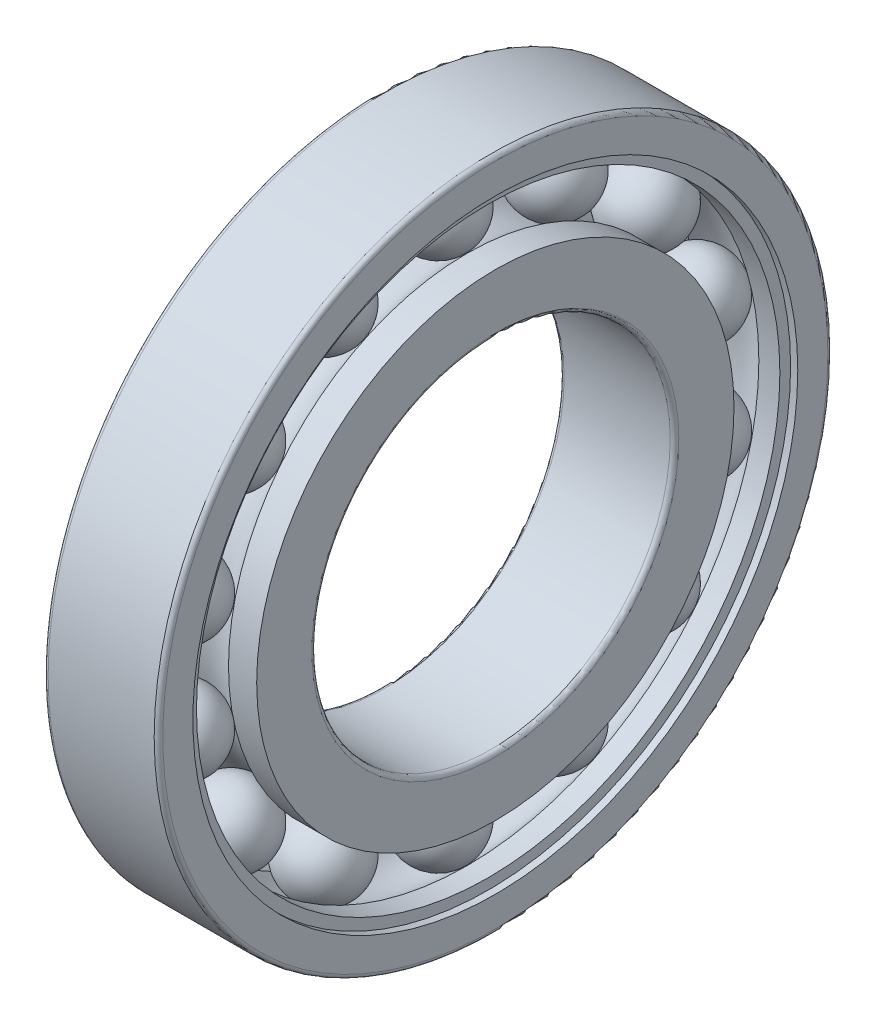
ISO-10303-21;
HEADER;
FILE_DESCRIPTION(('STEP AP214'),'2;1');
FILE_NAME('part.step','',(''),(''),'','','');
FILE_SCHEMA(('AUTOMOTIVE_DESIGN { 1 0 10303 214 1 1 1 1 }'));
ENDSEC;
DATA;
#1=APPLICATION_CONTEXT('core data for automotive mechanical design processes');
#2=APPLICATION_PROTOCOL_DEFINITION('international standard','automotive_design',2000,#1);
#3=PRODUCT_CONTEXT('',#1,'mechanical');
#4=PRODUCT('Part','Part','',(#3));
#5=PRODUCT_RELATED_PRODUCT_CATEGORY('part','',(#4));
#6=PRODUCT_DEFINITION_FORMATION('','',#4);
#7=PRODUCT_DEFINITION_CONTEXT('part definition',#1,'design');
#8=PRODUCT_DEFINITION('design','',#6,#7);
#9=PRODUCT_DEFINITION_SHAPE('','',#8);
#10=(LENGTH_UNIT() NAMED_UNIT(*) SI_UNIT(.MILLI.,.METRE.));
#11=(NAMED_UNIT(*) PLANE_ANGLE_UNIT() SI_UNIT($,.RADIAN.));
#12=(NAMED_UNIT(*) SI_UNIT($,.STERADIAN.) SOLID_ANGLE_UNIT());
#13=UNCERTAINTY_MEASURE_WITH_UNIT(LENGTH_MEASURE(1.E-05),#10,'distance_accuracy_value','');
#14=(GEOMETRIC_REPRESENTATION_CONTEXT(3) GLOBAL_UNCERTAINTY_ASSIGNED_CONTEXT((#13)) GLOBAL_UNIT_ASSIGNED_CONTEXT((#10,
#11,#12)) REPRESENTATION_CONTEXT('',''));
#15=CARTESIAN_POINT('',(0.,0.,0.));
#16=DIRECTION('',(0.,0.,1.));
#17=DIRECTION('',(1.,0.,0.));
#18=AXIS2_PLACEMENT_3D('',#15,#16,#17);
#19=CARTESIAN_POINT('',(0.,16.6679240561949,8.02684917367461));
#20=DIRECTION('',(-1.,0.,0.));
#21=DIRECTION('',(0.,0.900968867902425,0.433883739117546));
#22=AXIS2_PLACEMENT_3D('',#19,#20,#21);
#23=SPHERICAL_SURFACE('',#22,2.725);
#24=CARTESIAN_POINT('',(-2.725,16.6679240561949,8.02684917367461));
#25=VERTEX_POINT('',#24);
#26=VERTEX_LOOP('',#25);
#27=FACE_BOUND('',#26,.T.);
#28=ADVANCED_FACE('F37',(#27),#23,.T.);
#29=CLOSED_SHELL('',(#28));
#30=MANIFOLD_SOLID_BREP('B2',#29);
#31=CARTESIAN_POINT('',(0.,11.5345613343867,14.4638824256584));
#32=DIRECTION('',(-1.,0.,0.));
#33=DIRECTION('',(0.,0.623489801858743,0.781831482468022));
#34=AXIS2_PLACEMENT_3D('',#31,#32,#33);
#35=SPHERICAL_SURFACE('',#34,2.725);
#36=CARTESIAN_POINT('',(-2.725,11.5345613343867,14.4638824256584));
#37=VERTEX_POINT('',#36);
#38=VERTEX_LOOP('',#37);
#39=FACE_BOUND('',#38,.T.);
#40=ADVANCED_FACE('F55',(#39),#35,.T.);
#41=CLOSED_SHELL('',(#40));
#42=MANIFOLD_SOLID_BREP('B6',#41);
#43=CARTESIAN_POINT('',(0.,4.11663727819201,18.0361663753637));
#44=DIRECTION('',(-1.,0.,0.));
#45=DIRECTION('',(0.,0.222520933956325,0.974927912181821));
#46=AXIS2_PLACEMENT_3D('',#43,#44,#45);
#47=SPHERICAL_SURFACE('',#46,2.725);
#48=CARTESIAN_POINT('',(-2.725,4.11663727819201,18.0361663753637));
#49=VERTEX_POINT('',#48);
#50=VERTEX_LOOP('',#49);
#51=FACE_BOUND('',#50,.T.);
#52=ADVANCED_FACE('F73',(#51),#47,.T.);
#53=CLOSED_SHELL('',(#52));
#54=MANIFOLD_SOLID_BREP('B33',#53);
#55=CARTESIAN_POINT('',(0.,-4.11663727819164,18.0361663753638));
#56=DIRECTION('',(-1.,0.,0.));
#57=DIRECTION('',(0.,-0.222520933956305,0.974927912181826));
#58=AXIS2_PLACEMENT_3D('',#55,#56,#57);
#59=SPHERICAL_SURFACE('',#58,2.725);
#60=CARTESIAN_POINT('',(-2.725,-4.11663727819164,18.0361663753638));
#61=VERTEX_POINT('',#60);
#62=VERTEX_LOOP('',#61);
#63=FACE_BOUND('',#62,.T.);
#64=ADVANCED_FACE('F91',(#63),#59,.T.);
#65=CLOSED_SHELL('',(#64));
#66=MANIFOLD_SOLID_BREP('B51',#65);
#67=CARTESIAN_POINT('',(0.,-11.5345613343864,14.4638824256587));
#68=DIRECTION('',(-1.,0.,0.));
#69=DIRECTION('',(0.,-0.623489801858727,0.781831482468035));
#70=AXIS2_PLACEMENT_3D('',#67,#68,#69);
#71=SPHERICAL_SURFACE('',#70,2.725);
#72=CARTESIAN_POINT('',(-2.725,-11.5345613343864,14.4638824256587));
#73=VERTEX_POINT('',#72);
#74=VERTEX_LOOP('',#73);
#75=FACE_BOUND('',#74,.T.);
#76=ADVANCED_FACE('F109',(#75),#71,.T.);
#77=CLOSED_SHELL('',(#76));
#78=MANIFOLD_SOLID_BREP('B69',#77);
#79=CARTESIAN_POINT('',(0.,-16.6679240561947,8.02684917367496));
#80=DIRECTION('',(-1.,0.,0.));
#81=DIRECTION('',(0.,-0.900968867902416,0.433883739117565));
#82=AXIS2_PLACEMENT_3D('',#79,#80,#81);
#83=SPHERICAL_SURFACE('',#82,2.725);
#84=CARTESIAN_POINT('',(-2.725,-16.6679240561947,8.02684917367496));
#85=VERTEX_POINT('',#84);
#86=VERTEX_LOOP('',#85);
#87=FACE_BOUND('',#86,.T.);
#88=ADVANCED_FACE('F127',(#87),#83,.T.);
#89=CLOSED_SHELL('',(#88));
#90=MANIFOLD_SOLID_BREP('B87',#89);
#91=CARTESIAN_POINT('',(0.,-18.5,0.));
#92=DIRECTION('',(-1.,0.,0.));
#93=DIRECTION('',(0.,-1.,0.));
#94=AXIS2_PLACEMENT_3D('',#91,#92,#93);
#95=SPHERICAL_SURFACE('',#94,2.725);
#96=CARTESIAN_POINT('',(-2.725,-18.5,0.));
#97=VERTEX_POINT('',#96);
#98=VERTEX_LOOP('',#97);
#99=FACE_BOUND('',#98,.T.);
#100=ADVANCED_FACE('F145',(#99),#95,.T.);
#101=CLOSED_SHELL('',(#100));
#102=MANIFOLD_SOLID_BREP('B105',#101);
#103=CARTESIAN_POINT('',(0.,-16.6679240561948,-8.02684917367472));
#104=DIRECTION('',(-1.,0.,0.));
#105=DIRECTION('',(0.,-0.900968867902422,-0.433883739117553));
#106=AXIS2_PLACEMENT_3D('',#103,#104,#105);
#107=SPHERICAL_SURFACE('',#106,2.725);
#108=CARTESIAN_POINT('',(-2.725,-16.6679240561948,-8.02684917367472));
#109=VERTEX_POINT('',#108);
#110=VERTEX_LOOP('',#109);
#111=FACE_BOUND('',#110,.T.);
#112=ADVANCED_FACE('F163',(#111),#107,.T.);
#113=CLOSED_SHELL('',(#112));
#114=MANIFOLD_SOLID_BREP('B123',#113);
#115=CARTESIAN_POINT('',(0.,-11.5345613343866,-14.4638824256585));
#116=DIRECTION('',(-1.,0.,0.));
#117=DIRECTION('',(0.,-0.623489801858737,-0.781831482468027));
#118=AXIS2_PLACEMENT_3D('',#115,#116,#117);
#119=SPHERICAL_SURFACE('',#118,2.725);
#120=CARTESIAN_POINT('',(-2.725,-11.5345613343866,-14.4638824256585));
#121=VERTEX_POINT('',#120);
#122=VERTEX_LOOP('',#121);
#123=FACE_BOUND('',#122,.T.);
#124=ADVANCED_FACE('F181',(#123),#119,.T.);
#125=CLOSED_SHELL('',(#124));
#126=MANIFOLD_SOLID_BREP('B141',#125);
#127=CARTESIAN_POINT('',(0.,-4.11663727819189,-18.0361663753637));
#128=DIRECTION('',(-1.,0.,0.));
#129=DIRECTION('',(0.,-0.222520933956318,-0.974927912181823));
#130=AXIS2_PLACEMENT_3D('',#127,#128,#129);
#131=SPHERICAL_SURFACE('',#130,2.725);
#132=CARTESIAN_POINT('',(-2.725,-4.11663727819189,-18.0361663753637));
#133=VERTEX_POINT('',#132);
#134=VERTEX_LOOP('',#133);
#135=FACE_BOUND('',#134,.T.);
#136=ADVANCED_FACE('F199',(#135),#131,.T.);
#137=CLOSED_SHELL('',(#136));
#138=MANIFOLD_SOLID_BREP('B159',#137);
#139=CARTESIAN_POINT('',(0.,4.11663727819176,-18.0361663753637));
#140=DIRECTION('',(-1.,0.,0.));
#141=DIRECTION('',(0.,0.222520933956311,-0.974927912181824));
#142=AXIS2_PLACEMENT_3D('',#139,#140,#141);
#143=SPHERICAL_SURFACE('',#142,2.725);
#144=CARTESIAN_POINT('',(-2.725,4.11663727819176,-18.0361663753637));
#145=VERTEX_POINT('',#144);
#146=VERTEX_LOOP('',#145);
#147=FACE_BOUND('',#146,.T.);
#148=ADVANCED_FACE('F217',(#147),#143,.T.);
#149=CLOSED_SHELL('',(#148));
#150=MANIFOLD_SOLID_BREP('B177',#149);
#151=CARTESIAN_POINT('',(0.,11.5345613343865,-14.4638824256586));
#152=DIRECTION('',(-1.,0.,0.));
#153=DIRECTION('',(0.,0.623489801858732,-0.781831482468031));
#154=AXIS2_PLACEMENT_3D('',#151,#152,#153);
#155=SPHERICAL_SURFACE('',#154,2.725);
#156=CARTESIAN_POINT('',(-2.725,11.5345613343865,-14.4638824256586));
#157=VERTEX_POINT('',#156);
#158=VERTEX_LOOP('',#157);
#159=FACE_BOUND('',#158,.T.);
#160=ADVANCED_FACE('F235',(#159),#155,.T.);
#161=CLOSED_SHELL('',(#160));
#162=MANIFOLD_SOLID_BREP('B195',#161);
#163=CARTESIAN_POINT('',(0.,16.6679240561947,-8.02684917367484));
#164=DIRECTION('',(-1.,0.,0.));
#165=DIRECTION('',(0.,0.900968867902419,-0.433883739117559));
#166=AXIS2_PLACEMENT_3D('',#163,#164,#165);
#167=SPHERICAL_SURFACE('',#166,2.725);
#168=CARTESIAN_POINT('',(-2.725,16.6679240561947,-8.02684917367484));
#169=VERTEX_POINT('',#168);
#170=VERTEX_LOOP('',#169);
#171=FACE_BOUND('',#170,.T.);
#172=ADVANCED_FACE('F253',(#171),#167,.T.);
#173=CLOSED_SHELL('',(#172));
#174=MANIFOLD_SOLID_BREP('B213',#173);
#175=CARTESIAN_POINT('',(0.,18.5,0.));
#176=DIRECTION('',(-1.,0.,0.));
#177=DIRECTION('',(0.,1.,0.));
#178=AXIS2_PLACEMENT_3D('',#175,#176,#177);
#179=SPHERICAL_SURFACE('',#178,2.725);
#180=CARTESIAN_POINT('',(-2.725,18.5,0.));
#181=VERTEX_POINT('',#180);
#182=VERTEX_LOOP('',#181);
#183=FACE_BOUND('',#182,.T.);
#184=ADVANCED_FACE('F273',(#183),#179,.T.);
#185=CLOSED_SHELL('',(#184));
#186=MANIFOLD_SOLID_BREP('B231',#185);
#187=CARTESIAN_POINT('',(-4.00000000000001,0.,0.));
#188=DIRECTION('',(1.,0.,0.));
#189=DIRECTION('',(0.,0.,-1.));
#190=AXIS2_PLACEMENT_3D('',#187,#188,#189);
#191=PLANE('',#190);
#192=CARTESIAN_POINT('',(-4.00000000000001,0.,0.));
#193=DIRECTION('',(1.,0.,0.));
#194=DIRECTION('',(0.,0.,-1.));
#195=AXIS2_PLACEMENT_3D('',#192,#193,#194);
#196=CIRCLE('',#195,23.2);
#197=CARTESIAN_POINT('',(-4.00000000000001,0.,-23.2));
#198=VERTEX_POINT('',#197);
#199=EDGE_CURVE('E307',#198,#198,#196,.F.);
#200=ORIENTED_EDGE('',*,*,#199,.T.);
#201=EDGE_LOOP('',(#200));
#202=FACE_BOUND('',#201,.T.);
#203=CARTESIAN_POINT('',(-3.99999999999999,0.,0.));
#204=DIRECTION('',(1.,0.,0.));
#205=DIRECTION('',(0.,0.,-1.));
#206=AXIS2_PLACEMENT_3D('',#203,#204,#205);
#207=CIRCLE('',#206,21.1);
#208=CARTESIAN_POINT('',(-3.99999999999999,0.,-21.1));
#209=VERTEX_POINT('',#208);
#210=EDGE_CURVE('E328',#209,#209,#207,.T.);
#211=ORIENTED_EDGE('',*,*,#210,.T.);
#212=EDGE_LOOP('',(#211));
#213=FACE_BOUND('',#212,.T.);
#214=ADVANCED_FACE('F292',(#202,#213),#191,.F.);
#215=CARTESIAN_POINT('',(0.,0.,0.));
#216=DIRECTION('',(-1.,0.,0.));
#217=DIRECTION('',(0.,0.,1.));
#218=AXIS2_PLACEMENT_3D('',#215,#216,#217);
#219=CYLINDRICAL_SURFACE('',#218,20.35);
#220=CARTESIAN_POINT('',(-2.03469899493758,0.,0.));
#221=DIRECTION('',(-1.,0.,0.));
#222=DIRECTION('',(0.,0.,1.));
#223=AXIS2_PLACEMENT_3D('',#220,#221,#222);
#224=CIRCLE('',#223,20.35);
#225=CARTESIAN_POINT('',(-2.03469899493758,0.,20.35));
#226=VERTEX_POINT('',#225);
#227=EDGE_CURVE('E315',#226,#226,#224,.T.);
#228=ORIENTED_EDGE('',*,*,#227,.F.);
#229=EDGE_LOOP('',(#228));
#230=FACE_BOUND('',#229,.T.);
#231=CARTESIAN_POINT('',(-3.49999999999999,0.,0.));
#232=DIRECTION('',(1.,0.,0.));
#233=DIRECTION('',(0.,0.,-1.));
#234=AXIS2_PLACEMENT_3D('',#231,#232,#233);
#235=CIRCLE('',#234,20.35);
#236=CARTESIAN_POINT('',(-3.49999999999999,0.,-20.35));
#237=VERTEX_POINT('',#236);
#238=EDGE_CURVE('E331',#237,#237,#235,.T.);
#239=ORIENTED_EDGE('',*,*,#238,.F.);
#240=EDGE_LOOP('',(#239));
#241=FACE_BOUND('',#240,.T.);
#242=ADVANCED_FACE('F339',(#230,#241),#219,.F.);
#243=CARTESIAN_POINT('',(2.03469899493758,0.,0.));
#244=DIRECTION('',(-1.,0.,0.));
#245=DIRECTION('',(0.,0.,1.));
#246=AXIS2_PLACEMENT_3D('',#243,#244,#245);
#247=CIRCLE('',#246,20.35);
#248=CARTESIAN_POINT('',(2.03469899493758,0.,20.35));
#249=VERTEX_POINT('',#248);
#250=EDGE_CURVE('E312',#249,#249,#247,.T.);
#251=ORIENTED_EDGE('',*,*,#250,.T.);
#252=EDGE_LOOP('',(#251));
#253=FACE_BOUND('',#252,.T.);
#254=CARTESIAN_POINT('',(3.49999999999999,0.,0.));
#255=DIRECTION('',(1.,0.,0.));
#256=DIRECTION('',(0.,0.,-1.));
#257=AXIS2_PLACEMENT_3D('',#254,#255,#256);
#258=CIRCLE('',#257,20.35);
#259=CARTESIAN_POINT('',(3.49999999999999,0.,-20.35));
#260=VERTEX_POINT('',#259);
#261=EDGE_CURVE('E322',#260,#260,#258,.T.);
#262=ORIENTED_EDGE('',*,*,#261,.T.);
#263=EDGE_LOOP('',(#262));
#264=FACE_BOUND('',#263,.T.);
#265=ADVANCED_FACE('F341',(#253,#264),#219,.F.);
#266=CARTESIAN_POINT('',(0.,0.,0.));
#267=DIRECTION('',(-1.,0.,0.));
#268=DIRECTION('',(0.,0.,1.));
#269=AXIS2_PLACEMENT_3D('',#266,#267,#268);
#270=TOROIDAL_SURFACE('',#269,18.5,2.75);
#271=ORIENTED_EDGE('',*,*,#227,.T.);
#272=EDGE_LOOP('',(#271));
#273=FACE_BOUND('',#272,.T.);
#274=ORIENTED_EDGE('',*,*,#250,.F.);
#275=EDGE_LOOP('',(#274));
#276=FACE_BOUND('',#275,.T.);
#277=ADVANCED_FACE('F348',(#273,#276),#270,.F.);
#278=CARTESIAN_POINT('',(3.99999999999999,0.,0.));
#279=DIRECTION('',(1.,0.,0.));
#280=DIRECTION('',(0.,0.,-1.));
#281=AXIS2_PLACEMENT_3D('',#278,#279,#280);
#282=PLANE('',#281);
#283=CARTESIAN_POINT('',(3.99999999999999,0.,0.));
#284=DIRECTION('',(1.,0.,0.));
#285=DIRECTION('',(0.,0.,-1.));
#286=AXIS2_PLACEMENT_3D('',#283,#284,#285);
#287=CIRCLE('',#286,23.2);
#288=CARTESIAN_POINT('',(3.99999999999999,0.,-23.2));
#289=VERTEX_POINT('',#288);
#290=EDGE_CURVE('E272',#289,#289,#287,.T.);
#291=ORIENTED_EDGE('',*,*,#290,.T.);
#292=EDGE_LOOP('',(#291));
#293=FACE_BOUND('',#292,.T.);
#294=CARTESIAN_POINT('',(3.99999999999999,0.,0.));
#295=DIRECTION('',(1.,0.,0.));
#296=DIRECTION('',(0.,0.,-1.));
#297=AXIS2_PLACEMENT_3D('',#294,#295,#296);
#298=CIRCLE('',#297,21.1);
#299=CARTESIAN_POINT('',(3.99999999999999,0.,-21.1));
#300=VERTEX_POINT('',#299);
#301=EDGE_CURVE('E319',#300,#300,#298,.T.);
#302=ORIENTED_EDGE('',*,*,#301,.F.);
#303=EDGE_LOOP('',(#302));
#304=FACE_BOUND('',#303,.T.);
#305=ADVANCED_FACE('F360',(#293,#304),#282,.T.);
#306=CARTESIAN_POINT('',(0.,0.,0.));
#307=DIRECTION('',(-1.,0.,0.));
#308=DIRECTION('',(0.,0.,1.));
#309=AXIS2_PLACEMENT_3D('',#306,#307,#308);
#310=CYLINDRICAL_SURFACE('',#309,23.5);
#311=CARTESIAN_POINT('',(-3.70000000000001,0.,0.));
#312=DIRECTION('',(1.,0.,0.));
#313=DIRECTION('',(0.,0.,-1.));
#314=AXIS2_PLACEMENT_3D('',#311,#312,#313);
#315=CIRCLE('',#314,23.5);
#316=CARTESIAN_POINT('',(-3.70000000000001,0.,-23.5));
#317=VERTEX_POINT('',#316);
#318=EDGE_CURVE('E299',#317,#317,#315,.T.);
#319=ORIENTED_EDGE('',*,*,#318,.T.);
#320=EDGE_LOOP('',(#319));
#321=FACE_BOUND('',#320,.T.);
#322=CARTESIAN_POINT('',(3.69999999999999,0.,0.));
#323=DIRECTION('',(1.,0.,0.));
#324=DIRECTION('',(0.,0.,-1.));
#325=AXIS2_PLACEMENT_3D('',#322,#323,#324);
#326=CIRCLE('',#325,23.5);
#327=CARTESIAN_POINT('',(3.69999999999999,0.,-23.5));
#328=VERTEX_POINT('',#327);
#329=EDGE_CURVE('E303',#328,#328,#326,.F.);
#330=ORIENTED_EDGE('',*,*,#329,.T.);
#331=EDGE_LOOP('',(#330));
#332=FACE_BOUND('',#331,.T.);
#333=ADVANCED_FACE('F357',(#321,#332),#310,.T.);
#334=CARTESIAN_POINT('',(3.49999999999999,0.,0.));
#335=DIRECTION('',(1.,0.,0.));
#336=DIRECTION('',(0.,0.,-1.));
#337=AXIS2_PLACEMENT_3D('',#334,#335,#336);
#338=CYLINDRICAL_SURFACE('',#337,21.1);
#339=CARTESIAN_POINT('',(3.49999999999999,0.,0.));
#340=DIRECTION('',(1.,0.,0.));
#341=DIRECTION('',(0.,0.,-1.));
#342=AXIS2_PLACEMENT_3D('',#339,#340,#341);
#343=CIRCLE('',#342,21.1);
#344=CARTESIAN_POINT('',(3.49999999999999,0.,-21.1));
#345=VERTEX_POINT('',#344);
#346=EDGE_CURVE('E318',#345,#345,#343,.T.);
#347=ORIENTED_EDGE('',*,*,#346,.F.);
#348=EDGE_LOOP('',(#347));
#349=FACE_BOUND('',#348,.T.);
#350=ORIENTED_EDGE('',*,*,#301,.T.);
#351=EDGE_LOOP('',(#350));
#352=FACE_BOUND('',#351,.T.);
#353=ADVANCED_FACE('F354',(#349,#352),#338,.F.);
#354=CARTESIAN_POINT('',(3.49999999999999,0.,0.));
#355=DIRECTION('',(1.,0.,0.));
#356=DIRECTION('',(0.,0.,-1.));
#357=AXIS2_PLACEMENT_3D('',#354,#355,#356);
#358=PLANE('',#357);
#359=ORIENTED_EDGE('',*,*,#261,.F.);
#360=EDGE_LOOP('',(#359));
#361=FACE_BOUND('',#360,.T.);
#362=ORIENTED_EDGE('',*,*,#346,.T.);
#363=EDGE_LOOP('',(#362));
#364=FACE_BOUND('',#363,.T.);
#365=ADVANCED_FACE('F384',(#361,#364),#358,.T.);
#366=CARTESIAN_POINT('',(-3.49999999999999,0.,0.));
#367=DIRECTION('',(-1.,0.,0.));
#368=DIRECTION('',(0.,0.,-1.));
#369=AXIS2_PLACEMENT_3D('',#366,#367,#368);
#370=PLANE('',#369);
#371=CARTESIAN_POINT('',(-3.49999999999999,0.,0.));
#372=DIRECTION('',(1.,0.,0.));
#373=DIRECTION('',(0.,0.,-1.));
#374=AXIS2_PLACEMENT_3D('',#371,#372,#373);
#375=CIRCLE('',#374,21.1);
#376=CARTESIAN_POINT('',(-3.49999999999999,0.,-21.1));
#377=VERTEX_POINT('',#376);
#378=EDGE_CURVE('E327',#377,#377,#375,.T.);
#379=ORIENTED_EDGE('',*,*,#378,.F.);
#380=EDGE_LOOP('',(#379));
#381=FACE_BOUND('',#380,.T.);
#382=ORIENTED_EDGE('',*,*,#238,.T.);
#383=EDGE_LOOP('',(#382));
#384=FACE_BOUND('',#383,.T.);
#385=ADVANCED_FACE('F337',(#381,#384),#370,.T.);
#386=CARTESIAN_POINT('',(-3.49999999999999,0.,0.));
#387=DIRECTION('',(-1.,0.,0.));
#388=DIRECTION('',(0.,0.,1.));
#389=AXIS2_PLACEMENT_3D('',#386,#387,#388);
#390=CYLINDRICAL_SURFACE('',#389,21.1);
#391=ORIENTED_EDGE('',*,*,#378,.T.);
#392=EDGE_LOOP('',(#391));
#393=FACE_BOUND('',#392,.T.);
#394=ORIENTED_EDGE('',*,*,#210,.F.);
#395=EDGE_LOOP('',(#394));
#396=FACE_BOUND('',#395,.T.);
#397=ADVANCED_FACE('F367',(#393,#396),#390,.F.);
#398=CARTESIAN_POINT('',(-3.70000000000001,0.,0.));
#399=DIRECTION('',(1.,0.,0.));
#400=DIRECTION('',(0.,0.,-1.));
#401=AXIS2_PLACEMENT_3D('',#398,#399,#400);
#402=TOROIDAL_SURFACE('',#401,23.2,0.3);
#403=ORIENTED_EDGE('',*,*,#318,.F.);
#404=EDGE_LOOP('',(#403));
#405=FACE_BOUND('',#404,.T.);
#406=ORIENTED_EDGE('',*,*,#199,.F.);
#407=EDGE_LOOP('',(#406));
#408=FACE_BOUND('',#407,.T.);
#409=ADVANCED_FACE('F365',(#405,#408),#402,.T.);
#410=CARTESIAN_POINT('',(3.69999999999999,0.,0.));
#411=DIRECTION('',(1.,0.,0.));
#412=DIRECTION('',(0.,0.,-1.));
#413=AXIS2_PLACEMENT_3D('',#410,#411,#412);
#414=TOROIDAL_SURFACE('',#413,23.2,0.3);
#415=ORIENTED_EDGE('',*,*,#290,.F.);
#416=EDGE_LOOP('',(#415));
#417=FACE_BOUND('',#416,.T.);
#418=ORIENTED_EDGE('',*,*,#329,.F.);
#419=EDGE_LOOP('',(#418));
#420=FACE_BOUND('',#419,.T.);
#421=ADVANCED_FACE('F294',(#417,#420),#414,.T.);
#422=CLOSED_SHELL('',(#214,#242,#265,#277,#305,#333,#353,#365,#385,#397,#409,#421));
#423=MANIFOLD_SOLID_BREP('B249',#422);
#424=CARTESIAN_POINT('',(0.,0.,0.));
#425=DIRECTION('',(-1.,0.,0.));
#426=DIRECTION('',(0.,0.,1.));
#427=AXIS2_PLACEMENT_3D('',#424,#425,#426);
#428=TOROIDAL_SURFACE('',#427,18.5,2.75);
#429=CARTESIAN_POINT('',(2.03469899493758,0.,0.));
#430=DIRECTION('',(-1.,0.,0.));
#431=DIRECTION('',(0.,0.,1.));
#432=AXIS2_PLACEMENT_3D('',#429,#430,#431);
#433=CIRCLE('',#432,16.65);
#434=CARTESIAN_POINT('',(2.03469899493758,0.,16.65));
#435=VERTEX_POINT('',#434);
#436=EDGE_CURVE('E501',#435,#435,#433,.T.);
#437=ORIENTED_EDGE('',*,*,#436,.T.);
#438=EDGE_LOOP('',(#437));
#439=FACE_BOUND('',#438,.T.);
#440=CARTESIAN_POINT('',(-2.03469899493758,0.,0.));
#441=DIRECTION('',(-1.,0.,0.));
#442=DIRECTION('',(0.,0.,1.));
#443=AXIS2_PLACEMENT_3D('',#440,#441,#442);
#444=CIRCLE('',#443,16.65);
#445=CARTESIAN_POINT('',(-2.03469899493758,0.,16.65));
#446=VERTEX_POINT('',#445);
#447=EDGE_CURVE('E492',#446,#446,#444,.T.);
#448=ORIENTED_EDGE('',*,*,#447,.F.);
#449=EDGE_LOOP('',(#448));
#450=FACE_BOUND('',#449,.T.);
#451=ADVANCED_FACE('F472',(#439,#450),#428,.F.);
#452=CARTESIAN_POINT('',(0.,0.,0.));
#453=DIRECTION('',(-1.,0.,0.));
#454=DIRECTION('',(0.,0.,1.));
#455=AXIS2_PLACEMENT_3D('',#452,#453,#454);
#456=CYLINDRICAL_SURFACE('',#455,16.65);
#457=CARTESIAN_POINT('',(-4.,0.,0.));
#458=DIRECTION('',(-1.,0.,0.));
#459=DIRECTION('',(0.,0.,1.));
#460=AXIS2_PLACEMENT_3D('',#457,#458,#459);
#461=CIRCLE('',#460,16.65);
#462=CARTESIAN_POINT('',(-4.,0.,16.65));
#463=VERTEX_POINT('',#462);
#464=EDGE_CURVE('E495',#463,#463,#461,.T.);
#465=ORIENTED_EDGE('',*,*,#464,.F.);
#466=EDGE_LOOP('',(#465));
#467=FACE_BOUND('',#466,.T.);
#468=ORIENTED_EDGE('',*,*,#447,.T.);
#469=EDGE_LOOP('',(#468));
#470=FACE_BOUND('',#469,.T.);
#471=ADVANCED_FACE('F513',(#467,#470),#456,.T.);
#472=CARTESIAN_POINT('',(-4.,0.,0.));
#473=DIRECTION('',(1.,0.,0.));
#474=DIRECTION('',(0.,0.,-1.));
#475=AXIS2_PLACEMENT_3D('',#472,#473,#474);
#476=PLANE('',#475);
#477=CARTESIAN_POINT('',(-4.,0.,0.));
#478=DIRECTION('',(1.,0.,0.));
#479=DIRECTION('',(0.,0.,-1.));
#480=AXIS2_PLACEMENT_3D('',#477,#478,#479);
#481=CIRCLE('',#480,12.8);
#482=CARTESIAN_POINT('',(-4.,0.,-12.8));
#483=VERTEX_POINT('',#482);
#484=EDGE_CURVE('E479',#483,#483,#481,.T.);
#485=ORIENTED_EDGE('',*,*,#484,.T.);
#486=EDGE_LOOP('',(#485));
#487=FACE_BOUND('',#486,.T.);
#488=ORIENTED_EDGE('',*,*,#464,.T.);
#489=EDGE_LOOP('',(#488));
#490=FACE_BOUND('',#489,.T.);
#491=ADVANCED_FACE('F522',(#487,#490),#476,.F.);
#492=CARTESIAN_POINT('',(0.,0.,0.));
#493=DIRECTION('',(-1.,0.,0.));
#494=DIRECTION('',(0.,0.,1.));
#495=AXIS2_PLACEMENT_3D('',#492,#493,#494);
#496=CYLINDRICAL_SURFACE('',#495,12.5);
#497=CARTESIAN_POINT('',(-3.7,0.,0.));
#498=DIRECTION('',(1.,0.,0.));
#499=DIRECTION('',(0.,0.,-1.));
#500=AXIS2_PLACEMENT_3D('',#497,#498,#499);
#501=CIRCLE('',#500,12.5);
#502=CARTESIAN_POINT('',(-3.7,0.,-12.5));
#503=VERTEX_POINT('',#502);
#504=EDGE_CURVE('E483',#503,#503,#501,.F.);
#505=ORIENTED_EDGE('',*,*,#504,.T.);
#506=EDGE_LOOP('',(#505));
#507=FACE_BOUND('',#506,.T.);
#508=CARTESIAN_POINT('',(3.7,0.,0.));
#509=DIRECTION('',(1.,0.,0.));
#510=DIRECTION('',(0.,0.,-1.));
#511=AXIS2_PLACEMENT_3D('',#508,#509,#510);
#512=CIRCLE('',#511,12.5);
#513=CARTESIAN_POINT('',(3.7,0.,-12.5));
#514=VERTEX_POINT('',#513);
#515=EDGE_CURVE('E487',#514,#514,#512,.T.);
#516=ORIENTED_EDGE('',*,*,#515,.T.);
#517=EDGE_LOOP('',(#516));
#518=FACE_BOUND('',#517,.T.);
#519=ADVANCED_FACE('F517',(#507,#518),#496,.F.);
#520=CARTESIAN_POINT('',(4.,0.,0.));
#521=DIRECTION('',(1.,0.,0.));
#522=DIRECTION('',(0.,0.,-1.));
#523=AXIS2_PLACEMENT_3D('',#520,#521,#522);
#524=PLANE('',#523);
#525=CARTESIAN_POINT('',(4.,0.,0.));
#526=DIRECTION('',(1.,0.,0.));
#527=DIRECTION('',(0.,0.,-1.));
#528=AXIS2_PLACEMENT_3D('',#525,#526,#527);
#529=CIRCLE('',#528,12.8);
#530=CARTESIAN_POINT('',(4.,0.,-12.8));
#531=VERTEX_POINT('',#530);
#532=EDGE_CURVE('E291',#531,#531,#529,.F.);
#533=ORIENTED_EDGE('',*,*,#532,.T.);
#534=EDGE_LOOP('',(#533));
#535=FACE_BOUND('',#534,.T.);
#536=CARTESIAN_POINT('',(4.,0.,0.));
#537=DIRECTION('',(-1.,0.,0.));
#538=DIRECTION('',(0.,0.,1.));
#539=AXIS2_PLACEMENT_3D('',#536,#537,#538);
#540=CIRCLE('',#539,16.65);
#541=CARTESIAN_POINT('',(4.,0.,16.65));
#542=VERTEX_POINT('',#541);
#543=EDGE_CURVE('E498',#542,#542,#540,.T.);
#544=ORIENTED_EDGE('',*,*,#543,.F.);
#545=EDGE_LOOP('',(#544));
#546=FACE_BOUND('',#545,.T.);
#547=ADVANCED_FACE('F511',(#535,#546),#524,.T.);
#548=ORIENTED_EDGE('',*,*,#436,.F.);
#549=EDGE_LOOP('',(#548));
#550=FACE_BOUND('',#549,.T.);
#551=ORIENTED_EDGE('',*,*,#543,.T.);
#552=EDGE_LOOP('',(#551));
#553=FACE_BOUND('',#552,.T.);
#554=ADVANCED_FACE('F507',(#550,#553),#456,.T.);
#555=CARTESIAN_POINT('',(-3.7,0.,0.));
#556=DIRECTION('',(1.,0.,0.));
#557=DIRECTION('',(0.,0.,-1.));
#558=AXIS2_PLACEMENT_3D('',#555,#556,#557);
#559=TOROIDAL_SURFACE('',#558,12.8,0.3);
#560=ORIENTED_EDGE('',*,*,#484,.F.);
#561=EDGE_LOOP('',(#560));
#562=FACE_BOUND('',#561,.T.);
#563=ORIENTED_EDGE('',*,*,#504,.F.);
#564=EDGE_LOOP('',(#563));
#565=FACE_BOUND('',#564,.T.);
#566=ADVANCED_FACE('F510',(#562,#565),#559,.T.);
#567=CARTESIAN_POINT('',(3.7,0.,0.));
#568=DIRECTION('',(1.,0.,0.));
#569=DIRECTION('',(0.,0.,-1.));
#570=AXIS2_PLACEMENT_3D('',#567,#568,#569);
#571=TOROIDAL_SURFACE('',#570,12.8,0.3);
#572=ORIENTED_EDGE('',*,*,#515,.F.);
#573=EDGE_LOOP('',(#572));
#574=FACE_BOUND('',#573,.T.);
#575=ORIENTED_EDGE('',*,*,#532,.F.);
#576=EDGE_LOOP('',(#575));
#577=FACE_BOUND('',#576,.T.);
#578=ADVANCED_FACE('F474',(#574,#577),#571,.T.);
#579=CLOSED_SHELL('',(#451,#471,#491,#519,#547,#554,#566,#578));
#580=MANIFOLD_SOLID_BREP('B267',#579);
#581=ADVANCED_BREP_SHAPE_REPRESENTATION('',(#18,#30,#42,#54,#66,#78,#90,#102,#114,#126,#138,
#150,#162,#174,#186,#423,#580),#14);
#582=SHAPE_DEFINITION_REPRESENTATION(#9,#581);
ENDSEC;
END-ISO-10303-21;
